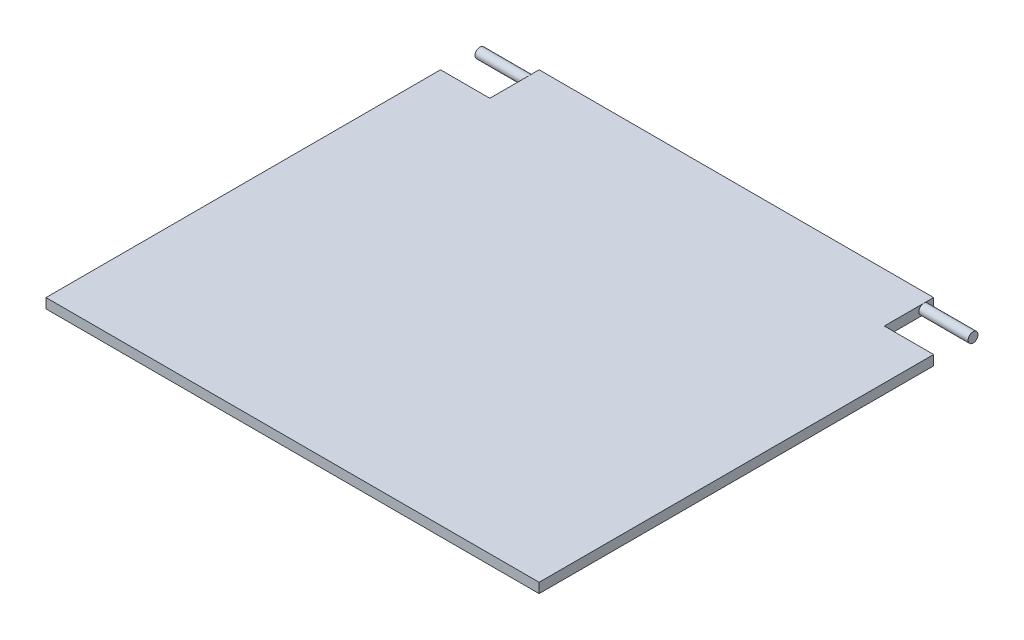
ISO-10303-21;
HEADER;
FILE_DESCRIPTION(('STEP AP214'),'2;1');
FILE_NAME('part.step','',(''),(''),'','','');
FILE_SCHEMA(('AUTOMOTIVE_DESIGN { 1 0 10303 214 1 1 1 1 }'));
ENDSEC;
DATA;
#1=APPLICATION_CONTEXT('core data for automotive mechanical design processes');
#2=APPLICATION_PROTOCOL_DEFINITION('international standard','automotive_design',2000,#1);
#3=PRODUCT_CONTEXT('',#1,'mechanical');
#4=PRODUCT('Part','Part','',(#3));
#5=PRODUCT_RELATED_PRODUCT_CATEGORY('part','',(#4));
#6=PRODUCT_DEFINITION_FORMATION('','',#4);
#7=PRODUCT_DEFINITION_CONTEXT('part definition',#1,'design');
#8=PRODUCT_DEFINITION('design','',#6,#7);
#9=PRODUCT_DEFINITION_SHAPE('','',#8);
#10=(LENGTH_UNIT() NAMED_UNIT(*) SI_UNIT(.MILLI.,.METRE.));
#11=(NAMED_UNIT(*) PLANE_ANGLE_UNIT() SI_UNIT($,.RADIAN.));
#12=(NAMED_UNIT(*) SI_UNIT($,.STERADIAN.) SOLID_ANGLE_UNIT());
#13=UNCERTAINTY_MEASURE_WITH_UNIT(LENGTH_MEASURE(1.E-05),#10,'distance_accuracy_value','');
#14=(GEOMETRIC_REPRESENTATION_CONTEXT(3) GLOBAL_UNCERTAINTY_ASSIGNED_CONTEXT((#13)) GLOBAL_UNIT_ASSIGNED_CONTEXT((#10,
#11,#12)) REPRESENTATION_CONTEXT('',''));
#15=CARTESIAN_POINT('',(0.,0.,0.));
#16=DIRECTION('',(0.,0.,1.));
#17=DIRECTION('',(1.,0.,0.));
#18=AXIS2_PLACEMENT_3D('',#15,#16,#17);
#19=CARTESIAN_POINT('',(200.,0.,-200.));
#20=DIRECTION('',(1.,0.,0.));
#21=DIRECTION('',(0.,0.,-1.));
#22=AXIS2_PLACEMENT_3D('',#19,#20,#21);
#23=PLANE('',#22);
#24=CARTESIAN_POINT('',(200.,5.,-240.));
#25=DIRECTION('',(1.,0.,0.));
#26=DIRECTION('',(0.,0.,-1.));
#27=AXIS2_PLACEMENT_3D('',#24,#25,#26);
#28=CIRCLE('',#27,4.99999999999999);
#29=CARTESIAN_POINT('',(200.,9.99999999999999,-240.));
#30=VERTEX_POINT('',#29);
#31=CARTESIAN_POINT('',(200.,0.,-240.));
#32=VERTEX_POINT('',#31);
#33=EDGE_CURVE('E11',#30,#32,#28,.T.);
#34=ORIENTED_EDGE('',*,*,#33,.F.);
#35=DIRECTION('',(0.,0.,-1.));
#36=VECTOR('',#35,1.);
#37=CARTESIAN_POINT('',(200.,10.,-200.));
#38=LINE('',#37,#36);
#39=CARTESIAN_POINT('',(200.,10.,-200.));
#40=VERTEX_POINT('',#39);
#41=EDGE_CURVE('E120',#40,#30,#38,.T.);
#42=ORIENTED_EDGE('',*,*,#41,.F.);
#43=DIRECTION('',(0.,1.,0.));
#44=VECTOR('',#43,1.);
#45=CARTESIAN_POINT('',(200.,0.,-200.));
#46=LINE('',#45,#44);
#47=CARTESIAN_POINT('',(200.,0.,-200.));
#48=VERTEX_POINT('',#47);
#49=EDGE_CURVE('E170',#48,#40,#46,.T.);
#50=ORIENTED_EDGE('',*,*,#49,.F.);
#51=DIRECTION('',(0.,0.,-1.));
#52=VECTOR('',#51,1.);
#53=CARTESIAN_POINT('',(200.,0.,-200.));
#54=LINE('',#53,#52);
#55=EDGE_CURVE('E140',#48,#32,#54,.T.);
#56=ORIENTED_EDGE('',*,*,#55,.T.);
#57=EDGE_LOOP('',(#34,#42,#50,#56));
#58=FACE_BOUND('',#57,.T.);
#59=ADVANCED_FACE('F43',(#58),#23,.T.);
#60=CARTESIAN_POINT('',(-200.,0.,-200.));
#61=DIRECTION('',(-1.,0.,0.));
#62=DIRECTION('',(0.,0.,1.));
#63=AXIS2_PLACEMENT_3D('',#60,#61,#62);
#64=PLANE('',#63);
#65=DIRECTION('',(0.,0.,1.));
#66=VECTOR('',#65,1.);
#67=CARTESIAN_POINT('',(-200.,0.,-200.));
#68=LINE('',#67,#66);
#69=CARTESIAN_POINT('',(-200.,0.,-250.));
#70=VERTEX_POINT('',#69);
#71=CARTESIAN_POINT('',(-200.,0.,-240.));
#72=VERTEX_POINT('',#71);
#73=EDGE_CURVE('E153',#70,#72,#68,.T.);
#74=ORIENTED_EDGE('',*,*,#73,.T.);
#75=CARTESIAN_POINT('',(-200.,5.,-240.));
#76=DIRECTION('',(-1.,0.,0.));
#77=DIRECTION('',(0.,0.,1.));
#78=AXIS2_PLACEMENT_3D('',#75,#76,#77);
#79=CIRCLE('',#78,4.99999999999999);
#80=CARTESIAN_POINT('',(-200.,9.99999999999999,-240.));
#81=VERTEX_POINT('',#80);
#82=EDGE_CURVE('E65',#81,#72,#79,.T.);
#83=ORIENTED_EDGE('',*,*,#82,.F.);
#84=DIRECTION('',(0.,0.,1.));
#85=VECTOR('',#84,1.);
#86=CARTESIAN_POINT('',(-200.,10.,-200.));
#87=LINE('',#86,#85);
#88=CARTESIAN_POINT('',(-200.,10.,-250.));
#89=VERTEX_POINT('',#88);
#90=EDGE_CURVE('E137',#89,#81,#87,.T.);
#91=ORIENTED_EDGE('',*,*,#90,.F.);
#92=DIRECTION('',(0.,1.,0.));
#93=VECTOR('',#92,1.);
#94=CARTESIAN_POINT('',(-200.,0.,-250.));
#95=LINE('',#94,#93);
#96=EDGE_CURVE('E166',#70,#89,#95,.T.);
#97=ORIENTED_EDGE('',*,*,#96,.F.);
#98=EDGE_LOOP('',(#74,#83,#91,#97));
#99=FACE_BOUND('',#98,.T.);
#100=ADVANCED_FACE('F218',(#99),#64,.T.);
#101=CARTESIAN_POINT('',(-250.,10.,-200.));
#102=DIRECTION('',(0.,0.,1.));
#103=DIRECTION('',(1.,0.,0.));
#104=AXIS2_PLACEMENT_3D('',#101,#102,#103);
#105=PLANE('',#104);
#106=DIRECTION('',(0.,1.,0.));
#107=VECTOR('',#106,1.);
#108=CARTESIAN_POINT('',(-200.,0.,-200.));
#109=LINE('',#108,#107);
#110=CARTESIAN_POINT('',(-200.,0.,-200.));
#111=VERTEX_POINT('',#110);
#112=CARTESIAN_POINT('',(-200.,10.,-200.));
#113=VERTEX_POINT('',#112);
#114=EDGE_CURVE('E162',#111,#113,#109,.T.);
#115=ORIENTED_EDGE('',*,*,#114,.F.);
#116=DIRECTION('',(-1.,0.,0.));
#117=VECTOR('',#116,1.);
#118=CARTESIAN_POINT('',(-250.,0.,-200.));
#119=LINE('',#118,#117);
#120=CARTESIAN_POINT('',(-250.,0.,-200.));
#121=VERTEX_POINT('',#120);
#122=EDGE_CURVE('E193',#111,#121,#119,.T.);
#123=ORIENTED_EDGE('',*,*,#122,.T.);
#124=DIRECTION('',(0.,-1.,0.));
#125=VECTOR('',#124,1.);
#126=CARTESIAN_POINT('',(-250.,10.,-200.));
#127=LINE('',#126,#125);
#128=CARTESIAN_POINT('',(-250.,10.,-200.));
#129=VERTEX_POINT('',#128);
#130=EDGE_CURVE('E184',#129,#121,#127,.T.);
#131=ORIENTED_EDGE('',*,*,#130,.F.);
#132=DIRECTION('',(-1.,0.,0.));
#133=VECTOR('',#132,1.);
#134=CARTESIAN_POINT('',(-250.,10.,-200.));
#135=LINE('',#134,#133);
#136=EDGE_CURVE('E182',#113,#129,#135,.T.);
#137=ORIENTED_EDGE('',*,*,#136,.F.);
#138=EDGE_LOOP('',(#115,#123,#131,#137));
#139=FACE_BOUND('',#138,.T.);
#140=ADVANCED_FACE('F239',(#139),#105,.F.);
#141=CARTESIAN_POINT('',(-250.,10.,-200.));
#142=DIRECTION('',(1.,0.,0.));
#143=DIRECTION('',(0.,0.,-1.));
#144=AXIS2_PLACEMENT_3D('',#141,#142,#143);
#145=PLANE('',#144);
#146=DIRECTION('',(0.,0.,1.));
#147=VECTOR('',#146,1.);
#148=CARTESIAN_POINT('',(-250.,0.,-200.));
#149=LINE('',#148,#147);
#150=CARTESIAN_POINT('',(-250.,0.,200.));
#151=VERTEX_POINT('',#150);
#152=EDGE_CURVE('E168',#121,#151,#149,.T.);
#153=ORIENTED_EDGE('',*,*,#152,.T.);
#154=DIRECTION('',(0.,-1.,0.));
#155=VECTOR('',#154,1.);
#156=CARTESIAN_POINT('',(-250.,10.,200.));
#157=LINE('',#156,#155);
#158=CARTESIAN_POINT('',(-250.,10.,200.));
#159=VERTEX_POINT('',#158);
#160=EDGE_CURVE('E204',#159,#151,#157,.T.);
#161=ORIENTED_EDGE('',*,*,#160,.F.);
#162=DIRECTION('',(0.,0.,1.));
#163=VECTOR('',#162,1.);
#164=CARTESIAN_POINT('',(-250.,10.,-200.));
#165=LINE('',#164,#163);
#166=EDGE_CURVE('E174',#129,#159,#165,.T.);
#167=ORIENTED_EDGE('',*,*,#166,.F.);
#168=ORIENTED_EDGE('',*,*,#130,.T.);
#169=EDGE_LOOP('',(#153,#161,#167,#168));
#170=FACE_BOUND('',#169,.T.);
#171=ADVANCED_FACE('F45',(#170),#145,.F.);
#172=CARTESIAN_POINT('',(-250.,10.,200.));
#173=DIRECTION('',(0.,0.,-1.));
#174=DIRECTION('',(-1.,0.,0.));
#175=AXIS2_PLACEMENT_3D('',#172,#173,#174);
#176=PLANE('',#175);
#177=DIRECTION('',(1.,0.,0.));
#178=VECTOR('',#177,1.);
#179=CARTESIAN_POINT('',(-250.,0.,200.));
#180=LINE('',#179,#178);
#181=CARTESIAN_POINT('',(250.,0.,200.));
#182=VERTEX_POINT('',#181);
#183=EDGE_CURVE('E188',#151,#182,#180,.T.);
#184=ORIENTED_EDGE('',*,*,#183,.T.);
#185=DIRECTION('',(0.,-1.,0.));
#186=VECTOR('',#185,1.);
#187=CARTESIAN_POINT('',(250.,10.,200.));
#188=LINE('',#187,#186);
#189=CARTESIAN_POINT('',(250.,10.,200.));
#190=VERTEX_POINT('',#189);
#191=EDGE_CURVE('E201',#190,#182,#188,.T.);
#192=ORIENTED_EDGE('',*,*,#191,.F.);
#193=DIRECTION('',(1.,0.,0.));
#194=VECTOR('',#193,1.);
#195=CARTESIAN_POINT('',(-250.,10.,200.));
#196=LINE('',#195,#194);
#197=EDGE_CURVE('E176',#159,#190,#196,.T.);
#198=ORIENTED_EDGE('',*,*,#197,.F.);
#199=ORIENTED_EDGE('',*,*,#160,.T.);
#200=EDGE_LOOP('',(#184,#192,#198,#199));
#201=FACE_BOUND('',#200,.T.);
#202=ADVANCED_FACE('F233',(#201),#176,.F.);
#203=CARTESIAN_POINT('',(250.,10.,-200.));
#204=DIRECTION('',(-1.,0.,0.));
#205=DIRECTION('',(0.,0.,1.));
#206=AXIS2_PLACEMENT_3D('',#203,#204,#205);
#207=PLANE('',#206);
#208=DIRECTION('',(0.,0.,-1.));
#209=VECTOR('',#208,1.);
#210=CARTESIAN_POINT('',(250.,0.,-200.));
#211=LINE('',#210,#209);
#212=CARTESIAN_POINT('',(250.,0.,-200.));
#213=VERTEX_POINT('',#212);
#214=EDGE_CURVE('E191',#182,#213,#211,.T.);
#215=ORIENTED_EDGE('',*,*,#214,.T.);
#216=DIRECTION('',(0.,-1.,0.));
#217=VECTOR('',#216,1.);
#218=CARTESIAN_POINT('',(250.,10.,-200.));
#219=LINE('',#218,#217);
#220=CARTESIAN_POINT('',(250.,10.,-200.));
#221=VERTEX_POINT('',#220);
#222=EDGE_CURVE('E198',#221,#213,#219,.T.);
#223=ORIENTED_EDGE('',*,*,#222,.F.);
#224=DIRECTION('',(0.,0.,-1.));
#225=VECTOR('',#224,1.);
#226=CARTESIAN_POINT('',(250.,10.,-200.));
#227=LINE('',#226,#225);
#228=EDGE_CURVE('E180',#190,#221,#227,.T.);
#229=ORIENTED_EDGE('',*,*,#228,.F.);
#230=ORIENTED_EDGE('',*,*,#191,.T.);
#231=EDGE_LOOP('',(#215,#223,#229,#230));
#232=FACE_BOUND('',#231,.T.);
#233=ADVANCED_FACE('F229',(#232),#207,.F.);
#234=EDGE_CURVE('E177',#213,#48,#119,.T.);
#235=ORIENTED_EDGE('',*,*,#234,.T.);
#236=ORIENTED_EDGE('',*,*,#49,.T.);
#237=EDGE_CURVE('E127',#221,#40,#135,.T.);
#238=ORIENTED_EDGE('',*,*,#237,.F.);
#239=ORIENTED_EDGE('',*,*,#222,.T.);
#240=EDGE_LOOP('',(#235,#236,#238,#239));
#241=FACE_BOUND('',#240,.T.);
#242=ADVANCED_FACE('F225',(#241),#105,.F.);
#243=CARTESIAN_POINT('',(0.,10.,0.));
#244=DIRECTION('',(0.,1.,0.));
#245=DIRECTION('',(0.,0.,1.));
#246=AXIS2_PLACEMENT_3D('',#243,#244,#245);
#247=PLANE('',#246);
#248=ORIENTED_EDGE('',*,*,#166,.T.);
#249=ORIENTED_EDGE('',*,*,#197,.T.);
#250=ORIENTED_EDGE('',*,*,#228,.T.);
#251=ORIENTED_EDGE('',*,*,#237,.T.);
#252=ORIENTED_EDGE('',*,*,#41,.T.);
#253=CARTESIAN_POINT('',(200.,10.,-250.));
#254=VERTEX_POINT('',#253);
#255=EDGE_CURVE('E124',#30,#254,#38,.T.);
#256=ORIENTED_EDGE('',*,*,#255,.T.);
#257=DIRECTION('',(-1.,0.,0.));
#258=VECTOR('',#257,1.);
#259=CARTESIAN_POINT('',(-200.,10.,-250.));
#260=LINE('',#259,#258);
#261=EDGE_CURVE('E131',#254,#89,#260,.T.);
#262=ORIENTED_EDGE('',*,*,#261,.T.);
#263=ORIENTED_EDGE('',*,*,#90,.T.);
#264=EDGE_CURVE('E151',#81,#113,#87,.T.);
#265=ORIENTED_EDGE('',*,*,#264,.T.);
#266=ORIENTED_EDGE('',*,*,#136,.T.);
#267=EDGE_LOOP('',(#248,#249,#250,#251,#252,#256,#262,#263,#265,#266));
#268=FACE_BOUND('',#267,.T.);
#269=ADVANCED_FACE('F122',(#268),#247,.T.);
#270=CARTESIAN_POINT('',(0.,0.,0.));
#271=DIRECTION('',(0.,1.,0.));
#272=DIRECTION('',(0.,0.,1.));
#273=AXIS2_PLACEMENT_3D('',#270,#271,#272);
#274=PLANE('',#273);
#275=ORIENTED_EDGE('',*,*,#152,.F.);
#276=ORIENTED_EDGE('',*,*,#122,.F.);
#277=EDGE_CURVE('E157',#72,#111,#68,.T.);
#278=ORIENTED_EDGE('',*,*,#277,.F.);
#279=ORIENTED_EDGE('',*,*,#73,.F.);
#280=DIRECTION('',(-1.,0.,0.));
#281=VECTOR('',#280,1.);
#282=CARTESIAN_POINT('',(-200.,0.,-250.));
#283=LINE('',#282,#281);
#284=CARTESIAN_POINT('',(200.,0.,-250.));
#285=VERTEX_POINT('',#284);
#286=EDGE_CURVE('E159',#285,#70,#283,.T.);
#287=ORIENTED_EDGE('',*,*,#286,.F.);
#288=EDGE_CURVE('E156',#32,#285,#54,.T.);
#289=ORIENTED_EDGE('',*,*,#288,.F.);
#290=ORIENTED_EDGE('',*,*,#55,.F.);
#291=ORIENTED_EDGE('',*,*,#234,.F.);
#292=ORIENTED_EDGE('',*,*,#214,.F.);
#293=ORIENTED_EDGE('',*,*,#183,.F.);
#294=EDGE_LOOP('',(#275,#276,#278,#279,#287,#289,#290,#291,#292,#293));
#295=FACE_BOUND('',#294,.T.);
#296=ADVANCED_FACE('F215',(#295),#274,.F.);
#297=ORIENTED_EDGE('',*,*,#264,.F.);
#298=CARTESIAN_POINT('',(-200.,5.,-240.));
#299=DIRECTION('',(-1.,0.,0.));
#300=DIRECTION('',(0.,0.,1.));
#301=AXIS2_PLACEMENT_3D('',#298,#299,#300);
#302=CIRCLE('',#301,4.99999999999999);
#303=EDGE_CURVE('E51',#81,#72,#302,.F.);
#304=ORIENTED_EDGE('',*,*,#303,.T.);
#305=ORIENTED_EDGE('',*,*,#277,.T.);
#306=ORIENTED_EDGE('',*,*,#114,.T.);
#307=EDGE_LOOP('',(#297,#304,#305,#306));
#308=FACE_BOUND('',#307,.T.);
#309=ADVANCED_FACE('F209',(#308),#64,.T.);
#310=CARTESIAN_POINT('',(-200.,0.,-250.));
#311=DIRECTION('',(0.,0.,-1.));
#312=DIRECTION('',(-1.,0.,0.));
#313=AXIS2_PLACEMENT_3D('',#310,#311,#312);
#314=PLANE('',#313);
#315=ORIENTED_EDGE('',*,*,#261,.F.);
#316=DIRECTION('',(0.,1.,0.));
#317=VECTOR('',#316,1.);
#318=CARTESIAN_POINT('',(200.,0.,-250.));
#319=LINE('',#318,#317);
#320=EDGE_CURVE('E135',#285,#254,#319,.T.);
#321=ORIENTED_EDGE('',*,*,#320,.F.);
#322=ORIENTED_EDGE('',*,*,#286,.T.);
#323=ORIENTED_EDGE('',*,*,#96,.T.);
#324=EDGE_LOOP('',(#315,#321,#322,#323));
#325=FACE_BOUND('',#324,.T.);
#326=ADVANCED_FACE('F221',(#325),#314,.T.);
#327=CARTESIAN_POINT('',(200.,5.,-240.));
#328=DIRECTION('',(-1.,0.,0.));
#329=DIRECTION('',(0.,0.,1.));
#330=AXIS2_PLACEMENT_3D('',#327,#328,#329);
#331=CIRCLE('',#330,4.99999999999999);
#332=EDGE_CURVE('E58',#30,#32,#331,.T.);
#333=ORIENTED_EDGE('',*,*,#332,.T.);
#334=ORIENTED_EDGE('',*,*,#288,.T.);
#335=ORIENTED_EDGE('',*,*,#320,.T.);
#336=ORIENTED_EDGE('',*,*,#255,.F.);
#337=EDGE_LOOP('',(#333,#334,#335,#336));
#338=FACE_BOUND('',#337,.T.);
#339=ADVANCED_FACE('F133',(#338),#23,.T.);
#340=CARTESIAN_POINT('',(-250.,5.,-240.));
#341=DIRECTION('',(1.,0.,0.));
#342=DIRECTION('',(0.,0.,-1.));
#343=AXIS2_PLACEMENT_3D('',#340,#341,#342);
#344=CYLINDRICAL_SURFACE('',#343,4.99999999999999);
#345=CARTESIAN_POINT('',(-250.,5.,-240.));
#346=DIRECTION('',(-1.,0.,0.));
#347=DIRECTION('',(0.,0.,1.));
#348=AXIS2_PLACEMENT_3D('',#345,#346,#347);
#349=CIRCLE('',#348,4.99999999999999);
#350=CARTESIAN_POINT('',(-250.,5.,-235.));
#351=VERTEX_POINT('',#350);
#352=EDGE_CURVE('E148',#351,#351,#349,.T.);
#353=ORIENTED_EDGE('',*,*,#352,.F.);
#354=EDGE_LOOP('',(#353));
#355=FACE_BOUND('',#354,.T.);
#356=ORIENTED_EDGE('',*,*,#82,.T.);
#357=ORIENTED_EDGE('',*,*,#303,.F.);
#358=EDGE_LOOP('',(#356,#357));
#359=FACE_BOUND('',#358,.T.);
#360=ADVANCED_FACE('F259',(#355,#359),#344,.T.);
#361=CARTESIAN_POINT('',(-250.,5.,-240.));
#362=DIRECTION('',(-1.,0.,0.));
#363=DIRECTION('',(0.,0.,1.));
#364=AXIS2_PLACEMENT_3D('',#361,#362,#363);
#365=PLANE('',#364);
#366=ORIENTED_EDGE('',*,*,#352,.T.);
#367=EDGE_LOOP('',(#366));
#368=FACE_BOUND('',#367,.T.);
#369=ADVANCED_FACE('F265',(#368),#365,.T.);
#370=CARTESIAN_POINT('',(250.,5.,-240.));
#371=DIRECTION('',(-1.,0.,0.));
#372=DIRECTION('',(0.,0.,1.));
#373=AXIS2_PLACEMENT_3D('',#370,#371,#372);
#374=CYLINDRICAL_SURFACE('',#373,4.99999999999999);
#375=CARTESIAN_POINT('',(250.,5.,-240.));
#376=DIRECTION('',(-1.,0.,0.));
#377=DIRECTION('',(0.,0.,1.));
#378=AXIS2_PLACEMENT_3D('',#375,#376,#377);
#379=CIRCLE('',#378,4.99999999999999);
#380=CARTESIAN_POINT('',(250.,5.,-235.));
#381=VERTEX_POINT('',#380);
#382=EDGE_CURVE('E143',#381,#381,#379,.T.);
#383=ORIENTED_EDGE('',*,*,#382,.T.);
#384=EDGE_LOOP('',(#383));
#385=FACE_BOUND('',#384,.T.);
#386=ORIENTED_EDGE('',*,*,#332,.F.);
#387=ORIENTED_EDGE('',*,*,#33,.T.);
#388=EDGE_LOOP('',(#386,#387));
#389=FACE_BOUND('',#388,.T.);
#390=ADVANCED_FACE('F142',(#385,#389),#374,.T.);
#391=CARTESIAN_POINT('',(250.,5.,-240.));
#392=DIRECTION('',(1.,0.,0.));
#393=DIRECTION('',(0.,0.,1.));
#394=AXIS2_PLACEMENT_3D('',#391,#392,#393);
#395=PLANE('',#394);
#396=ORIENTED_EDGE('',*,*,#382,.F.);
#397=EDGE_LOOP('',(#396));
#398=FACE_BOUND('',#397,.T.);
#399=ADVANCED_FACE('F276',(#398),#395,.T.);
#400=CLOSED_SHELL('',(#59,#100,#140,#171,#202,#233,#242,#269,#296,#309,#326,#339,#360,#369,#390,#399));
#401=MANIFOLD_SOLID_BREP('B2',#400);
#402=ADVANCED_BREP_SHAPE_REPRESENTATION('',(#18,#401),#14);
#403=SHAPE_DEFINITION_REPRESENTATION(#9,#402);
ENDSEC;
END-ISO-10303-21;
